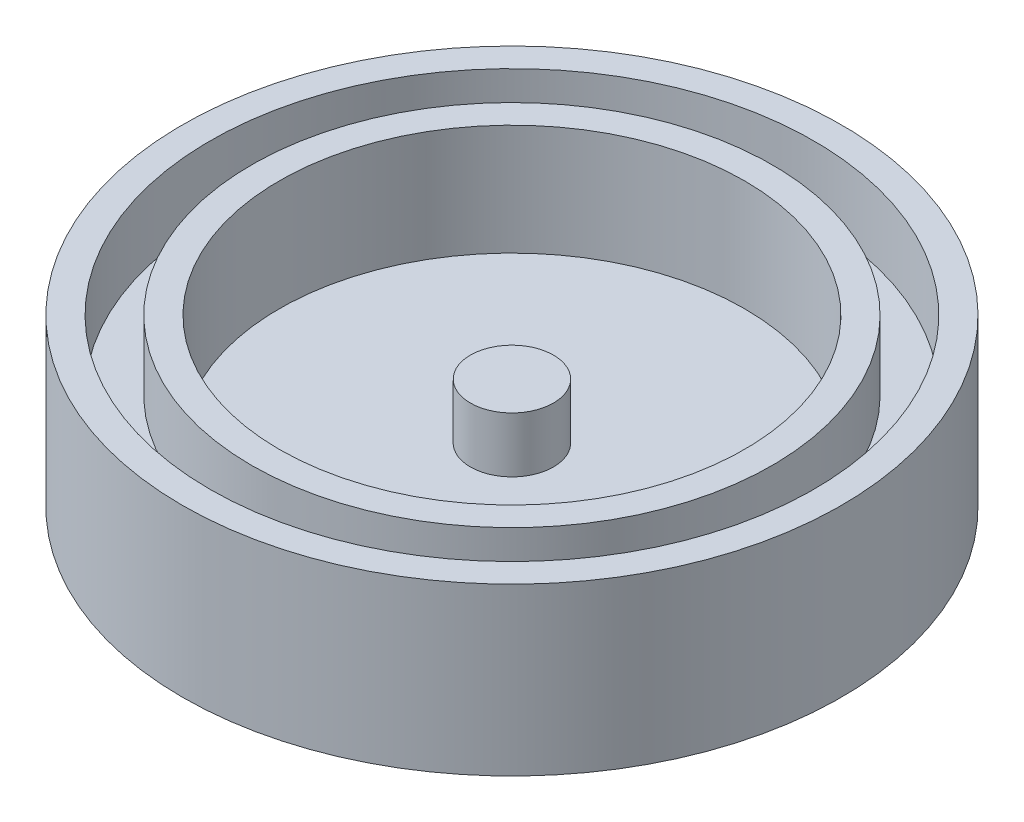
ISO-10303-21;
HEADER;
FILE_DESCRIPTION(('STEP AP214'),'2;1');
FILE_NAME('part.step','',(''),(''),'','','');
FILE_SCHEMA(('AUTOMOTIVE_DESIGN { 1 0 10303 214 1 1 1 1 }'));
ENDSEC;
DATA;
#1=APPLICATION_CONTEXT('core data for automotive mechanical design processes');
#2=APPLICATION_PROTOCOL_DEFINITION('international standard','automotive_design',2000,#1);
#3=PRODUCT_CONTEXT('',#1,'mechanical');
#4=PRODUCT('Part','Part','',(#3));
#5=PRODUCT_RELATED_PRODUCT_CATEGORY('part','',(#4));
#6=PRODUCT_DEFINITION_FORMATION('','',#4);
#7=PRODUCT_DEFINITION_CONTEXT('part definition',#1,'design');
#8=PRODUCT_DEFINITION('design','',#6,#7);
#9=PRODUCT_DEFINITION_SHAPE('','',#8);
#10=(LENGTH_UNIT() NAMED_UNIT(*) SI_UNIT(.MILLI.,.METRE.));
#11=(NAMED_UNIT(*) PLANE_ANGLE_UNIT() SI_UNIT($,.RADIAN.));
#12=(NAMED_UNIT(*) SI_UNIT($,.STERADIAN.) SOLID_ANGLE_UNIT());
#13=UNCERTAINTY_MEASURE_WITH_UNIT(LENGTH_MEASURE(1.E-05),#10,'distance_accuracy_value','');
#14=(GEOMETRIC_REPRESENTATION_CONTEXT(3) GLOBAL_UNCERTAINTY_ASSIGNED_CONTEXT((#13)) GLOBAL_UNIT_ASSIGNED_CONTEXT((#10,
#11,#12)) REPRESENTATION_CONTEXT('',''));
#15=CARTESIAN_POINT('',(0.,0.,0.));
#16=DIRECTION('',(0.,0.,1.));
#17=DIRECTION('',(1.,0.,0.));
#18=AXIS2_PLACEMENT_3D('',#15,#16,#17);
#19=CARTESIAN_POINT('',(0.,0.,0.));
#20=DIRECTION('',(0.,-1.,0.));
#21=DIRECTION('',(0.,0.,-1.));
#22=AXIS2_PLACEMENT_3D('',#19,#20,#21);
#23=PLANE('',#22);
#24=CARTESIAN_POINT('',(0.,0.,0.));
#25=DIRECTION('',(0.,1.,0.));
#26=DIRECTION('',(0.,0.,1.));
#27=AXIS2_PLACEMENT_3D('',#24,#25,#26);
#28=CIRCLE('',#27,23.8);
#29=CARTESIAN_POINT('',(0.,0.,23.8));
#30=VERTEX_POINT('',#29);
#31=EDGE_CURVE('E10',#30,#30,#28,.T.);
#32=ORIENTED_EDGE('',*,*,#31,.F.);
#33=EDGE_LOOP('',(#32));
#34=FACE_BOUND('',#33,.T.);
#35=ADVANCED_FACE('F37',(#34),#23,.T.);
#36=CARTESIAN_POINT('',(0.,8.,0.));
#37=DIRECTION('',(0.,1.,0.));
#38=DIRECTION('',(0.,0.,1.));
#39=AXIS2_PLACEMENT_3D('',#36,#37,#38);
#40=CYLINDRICAL_SURFACE('',#39,23.8);
#41=ORIENTED_EDGE('',*,*,#31,.T.);
#42=EDGE_LOOP('',(#41));
#43=FACE_BOUND('',#42,.T.);
#44=CARTESIAN_POINT('',(0.,12.,0.));
#45=DIRECTION('',(0.,1.,0.));
#46=DIRECTION('',(0.,0.,1.));
#47=AXIS2_PLACEMENT_3D('',#44,#45,#46);
#48=CIRCLE('',#47,23.8);
#49=CARTESIAN_POINT('',(0.,12.,23.8));
#50=VERTEX_POINT('',#49);
#51=EDGE_CURVE('E43',#50,#50,#48,.T.);
#52=ORIENTED_EDGE('',*,*,#51,.F.);
#53=EDGE_LOOP('',(#52));
#54=FACE_BOUND('',#53,.T.);
#55=ADVANCED_FACE('F91',(#43,#54),#40,.T.);
#56=CARTESIAN_POINT('',(-23.8,12.,0.));
#57=DIRECTION('',(0.,1.,0.));
#58=DIRECTION('',(0.,0.,1.));
#59=AXIS2_PLACEMENT_3D('',#56,#57,#58);
#60=PLANE('',#59);
#61=ORIENTED_EDGE('',*,*,#51,.T.);
#62=EDGE_LOOP('',(#61));
#63=FACE_BOUND('',#62,.T.);
#64=CARTESIAN_POINT('',(0.,12.,0.));
#65=DIRECTION('',(0.,1.,0.));
#66=DIRECTION('',(0.,0.,1.));
#67=AXIS2_PLACEMENT_3D('',#64,#65,#66);
#68=CIRCLE('',#67,21.8);
#69=CARTESIAN_POINT('',(0.,12.,21.8));
#70=VERTEX_POINT('',#69);
#71=EDGE_CURVE('E47',#70,#70,#68,.T.);
#72=ORIENTED_EDGE('',*,*,#71,.F.);
#73=EDGE_LOOP('',(#72));
#74=FACE_BOUND('',#73,.T.);
#75=ADVANCED_FACE('F96',(#63,#74),#60,.T.);
#76=CARTESIAN_POINT('',(0.,8.,0.));
#77=DIRECTION('',(0.,1.,0.));
#78=DIRECTION('',(0.,0.,1.));
#79=AXIS2_PLACEMENT_3D('',#76,#77,#78);
#80=CYLINDRICAL_SURFACE('',#79,21.8);
#81=ORIENTED_EDGE('',*,*,#71,.T.);
#82=EDGE_LOOP('',(#81));
#83=FACE_BOUND('',#82,.T.);
#84=CARTESIAN_POINT('',(0.,7.,0.));
#85=DIRECTION('',(0.,1.,0.));
#86=DIRECTION('',(0.,0.,1.));
#87=AXIS2_PLACEMENT_3D('',#84,#85,#86);
#88=CIRCLE('',#87,21.8);
#89=CARTESIAN_POINT('',(0.,7.,21.8));
#90=VERTEX_POINT('',#89);
#91=EDGE_CURVE('E51',#90,#90,#88,.T.);
#92=ORIENTED_EDGE('',*,*,#91,.F.);
#93=EDGE_LOOP('',(#92));
#94=FACE_BOUND('',#93,.T.);
#95=ADVANCED_FACE('F100',(#83,#94),#80,.F.);
#96=CARTESIAN_POINT('',(-21.8,7.,0.));
#97=DIRECTION('',(0.,1.,0.));
#98=DIRECTION('',(0.,0.,1.));
#99=AXIS2_PLACEMENT_3D('',#96,#97,#98);
#100=PLANE('',#99);
#101=ORIENTED_EDGE('',*,*,#91,.T.);
#102=EDGE_LOOP('',(#101));
#103=FACE_BOUND('',#102,.T.);
#104=CARTESIAN_POINT('',(0.,7.,0.));
#105=DIRECTION('',(0.,1.,0.));
#106=DIRECTION('',(0.,0.,1.));
#107=AXIS2_PLACEMENT_3D('',#104,#105,#106);
#108=CIRCLE('',#107,18.8);
#109=CARTESIAN_POINT('',(0.,7.,18.8));
#110=VERTEX_POINT('',#109);
#111=EDGE_CURVE('E56',#110,#110,#108,.T.);
#112=ORIENTED_EDGE('',*,*,#111,.F.);
#113=EDGE_LOOP('',(#112));
#114=FACE_BOUND('',#113,.T.);
#115=ADVANCED_FACE('F106',(#103,#114),#100,.T.);
#116=CARTESIAN_POINT('',(0.,8.,0.));
#117=DIRECTION('',(0.,1.,0.));
#118=DIRECTION('',(0.,0.,1.));
#119=AXIS2_PLACEMENT_3D('',#116,#117,#118);
#120=CYLINDRICAL_SURFACE('',#119,18.8);
#121=ORIENTED_EDGE('',*,*,#111,.T.);
#122=EDGE_LOOP('',(#121));
#123=FACE_BOUND('',#122,.T.);
#124=CARTESIAN_POINT('',(0.,12.,0.));
#125=DIRECTION('',(0.,1.,0.));
#126=DIRECTION('',(0.,0.,1.));
#127=AXIS2_PLACEMENT_3D('',#124,#125,#126);
#128=CIRCLE('',#127,18.8);
#129=CARTESIAN_POINT('',(0.,12.,18.8));
#130=VERTEX_POINT('',#129);
#131=EDGE_CURVE('E59',#130,#130,#128,.T.);
#132=ORIENTED_EDGE('',*,*,#131,.F.);
#133=EDGE_LOOP('',(#132));
#134=FACE_BOUND('',#133,.T.);
#135=ADVANCED_FACE('F110',(#123,#134),#120,.T.);
#136=CARTESIAN_POINT('',(-18.8,12.,0.));
#137=DIRECTION('',(0.,1.,0.));
#138=DIRECTION('',(0.,0.,1.));
#139=AXIS2_PLACEMENT_3D('',#136,#137,#138);
#140=PLANE('',#139);
#141=ORIENTED_EDGE('',*,*,#131,.T.);
#142=EDGE_LOOP('',(#141));
#143=FACE_BOUND('',#142,.T.);
#144=CARTESIAN_POINT('',(0.,12.,0.));
#145=DIRECTION('',(0.,1.,0.));
#146=DIRECTION('',(0.,0.,1.));
#147=AXIS2_PLACEMENT_3D('',#144,#145,#146);
#148=CIRCLE('',#147,16.8);
#149=CARTESIAN_POINT('',(0.,12.,16.8));
#150=VERTEX_POINT('',#149);
#151=EDGE_CURVE('E62',#150,#150,#148,.T.);
#152=ORIENTED_EDGE('',*,*,#151,.F.);
#153=EDGE_LOOP('',(#152));
#154=FACE_BOUND('',#153,.T.);
#155=ADVANCED_FACE('F114',(#143,#154),#140,.T.);
#156=CARTESIAN_POINT('',(0.,8.,0.));
#157=DIRECTION('',(0.,1.,0.));
#158=DIRECTION('',(0.,0.,1.));
#159=AXIS2_PLACEMENT_3D('',#156,#157,#158);
#160=CYLINDRICAL_SURFACE('',#159,16.8);
#161=ORIENTED_EDGE('',*,*,#151,.T.);
#162=EDGE_LOOP('',(#161));
#163=FACE_BOUND('',#162,.T.);
#164=CARTESIAN_POINT('',(0.,4.,0.));
#165=DIRECTION('',(0.,1.,0.));
#166=DIRECTION('',(0.,0.,1.));
#167=AXIS2_PLACEMENT_3D('',#164,#165,#166);
#168=CIRCLE('',#167,16.8);
#169=CARTESIAN_POINT('',(0.,4.,16.8));
#170=VERTEX_POINT('',#169);
#171=EDGE_CURVE('E65',#170,#170,#168,.T.);
#172=ORIENTED_EDGE('',*,*,#171,.F.);
#173=EDGE_LOOP('',(#172));
#174=FACE_BOUND('',#173,.T.);
#175=ADVANCED_FACE('F87',(#163,#174),#160,.F.);
#176=CARTESIAN_POINT('',(-16.8,4.,0.));
#177=DIRECTION('',(0.,1.,0.));
#178=DIRECTION('',(0.,0.,1.));
#179=AXIS2_PLACEMENT_3D('',#176,#177,#178);
#180=PLANE('',#179);
#181=ORIENTED_EDGE('',*,*,#171,.T.);
#182=EDGE_LOOP('',(#181));
#183=FACE_BOUND('',#182,.T.);
#184=CARTESIAN_POINT('',(0.,4.,0.));
#185=DIRECTION('',(0.,1.,0.));
#186=DIRECTION('',(0.,0.,1.));
#187=AXIS2_PLACEMENT_3D('',#184,#185,#186);
#188=CIRCLE('',#187,3.);
#189=CARTESIAN_POINT('',(0.,4.,3.));
#190=VERTEX_POINT('',#189);
#191=EDGE_CURVE('E68',#190,#190,#188,.T.);
#192=ORIENTED_EDGE('',*,*,#191,.F.);
#193=EDGE_LOOP('',(#192));
#194=FACE_BOUND('',#193,.T.);
#195=ADVANCED_FACE('F79',(#183,#194),#180,.T.);
#196=CARTESIAN_POINT('',(0.,8.,0.));
#197=DIRECTION('',(0.,1.,0.));
#198=DIRECTION('',(0.,0.,1.));
#199=AXIS2_PLACEMENT_3D('',#196,#197,#198);
#200=CYLINDRICAL_SURFACE('',#199,3.);
#201=ORIENTED_EDGE('',*,*,#191,.T.);
#202=EDGE_LOOP('',(#201));
#203=FACE_BOUND('',#202,.T.);
#204=CARTESIAN_POINT('',(0.,8.,0.));
#205=DIRECTION('',(0.,1.,0.));
#206=DIRECTION('',(0.,0.,1.));
#207=AXIS2_PLACEMENT_3D('',#204,#205,#206);
#208=CIRCLE('',#207,3.);
#209=CARTESIAN_POINT('',(0.,8.,3.));
#210=VERTEX_POINT('',#209);
#211=EDGE_CURVE('E71',#210,#210,#208,.T.);
#212=ORIENTED_EDGE('',*,*,#211,.F.);
#213=EDGE_LOOP('',(#212));
#214=FACE_BOUND('',#213,.T.);
#215=ADVANCED_FACE('F77',(#203,#214),#200,.T.);
#216=CARTESIAN_POINT('',(-3.,8.,0.));
#217=DIRECTION('',(0.,1.,0.));
#218=DIRECTION('',(0.,0.,1.));
#219=AXIS2_PLACEMENT_3D('',#216,#217,#218);
#220=PLANE('',#219);
#221=ORIENTED_EDGE('',*,*,#211,.T.);
#222=EDGE_LOOP('',(#221));
#223=FACE_BOUND('',#222,.T.);
#224=ADVANCED_FACE('F75',(#223),#220,.T.);
#225=CLOSED_SHELL('',(#35,#55,#75,#95,#115,#135,#155,#175,#195,#215,#224));
#226=MANIFOLD_SOLID_BREP('B2',#225);
#227=ADVANCED_BREP_SHAPE_REPRESENTATION('',(#18,#226),#14);
#228=SHAPE_DEFINITION_REPRESENTATION(#9,#227);
ENDSEC;
END-ISO-10303-21;
